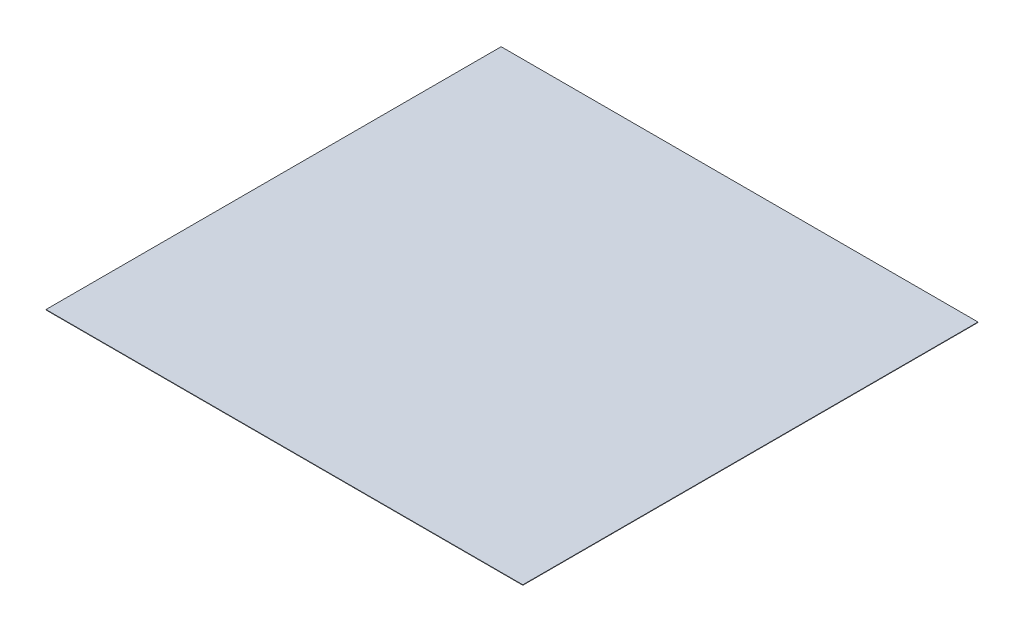
ISO-10303-21;
HEADER;
FILE_DESCRIPTION(('STEP AP214'),'2;1');
FILE_NAME('part.step','',(''),(''),'','','');
FILE_SCHEMA(('AUTOMOTIVE_DESIGN { 1 0 10303 214 1 1 1 1 }'));
ENDSEC;
DATA;
#1=APPLICATION_CONTEXT('core data for automotive mechanical design processes');
#2=APPLICATION_PROTOCOL_DEFINITION('international standard','automotive_design',2000,#1);
#3=PRODUCT_CONTEXT('',#1,'mechanical');
#4=PRODUCT('Part','Part','',(#3));
#5=PRODUCT_RELATED_PRODUCT_CATEGORY('part','',(#4));
#6=PRODUCT_DEFINITION_FORMATION('','',#4);
#7=PRODUCT_DEFINITION_CONTEXT('part definition',#1,'design');
#8=PRODUCT_DEFINITION('design','',#6,#7);
#9=PRODUCT_DEFINITION_SHAPE('','',#8);
#10=(LENGTH_UNIT() NAMED_UNIT(*) SI_UNIT(.MILLI.,.METRE.));
#11=(NAMED_UNIT(*) PLANE_ANGLE_UNIT() SI_UNIT($,.RADIAN.));
#12=(NAMED_UNIT(*) SI_UNIT($,.STERADIAN.) SOLID_ANGLE_UNIT());
#13=UNCERTAINTY_MEASURE_WITH_UNIT(LENGTH_MEASURE(1.E-05),#10,'distance_accuracy_value','');
#14=(GEOMETRIC_REPRESENTATION_CONTEXT(3) GLOBAL_UNCERTAINTY_ASSIGNED_CONTEXT((#13)) GLOBAL_UNIT_ASSIGNED_CONTEXT((#10,
#11,#12)) REPRESENTATION_CONTEXT('',''));
#15=CARTESIAN_POINT('',(0.,0.,0.));
#16=DIRECTION('',(0.,0.,1.));
#17=DIRECTION('',(1.,0.,0.));
#18=AXIS2_PLACEMENT_3D('',#15,#16,#17);
#19=CARTESIAN_POINT('',(-110.,0.2,105.));
#20=DIRECTION('',(1.,0.,0.));
#21=DIRECTION('',(0.,0.,-1.));
#22=AXIS2_PLACEMENT_3D('',#19,#20,#21);
#23=PLANE('',#22);
#24=DIRECTION('',(0.,0.,1.));
#25=VECTOR('',#24,1.);
#26=CARTESIAN_POINT('',(-110.,0.,105.));
#27=LINE('',#26,#25);
#28=CARTESIAN_POINT('',(-110.,0.,-105.));
#29=VERTEX_POINT('',#28);
#30=CARTESIAN_POINT('',(-110.,0.,105.));
#31=VERTEX_POINT('',#30);
#32=EDGE_CURVE('E96',#29,#31,#27,.T.);
#33=ORIENTED_EDGE('',*,*,#32,.T.);
#34=DIRECTION('',(0.,-1.,0.));
#35=VECTOR('',#34,1.);
#36=CARTESIAN_POINT('',(-110.,0.2,105.));
#37=LINE('',#36,#35);
#38=CARTESIAN_POINT('',(-110.,0.2,105.));
#39=VERTEX_POINT('',#38);
#40=EDGE_CURVE('E11',#39,#31,#37,.T.);
#41=ORIENTED_EDGE('',*,*,#40,.F.);
#42=DIRECTION('',(0.,0.,1.));
#43=VECTOR('',#42,1.);
#44=CARTESIAN_POINT('',(-110.,0.2,105.));
#45=LINE('',#44,#43);
#46=CARTESIAN_POINT('',(-110.,0.2,-105.));
#47=VERTEX_POINT('',#46);
#48=EDGE_CURVE('E84',#47,#39,#45,.T.);
#49=ORIENTED_EDGE('',*,*,#48,.F.);
#50=DIRECTION('',(0.,-1.,0.));
#51=VECTOR('',#50,1.);
#52=CARTESIAN_POINT('',(-110.,0.2,-105.));
#53=LINE('',#52,#51);
#54=EDGE_CURVE('E92',#47,#29,#53,.T.);
#55=ORIENTED_EDGE('',*,*,#54,.T.);
#56=EDGE_LOOP('',(#33,#41,#49,#55));
#57=FACE_BOUND('',#56,.T.);
#58=ADVANCED_FACE('F33',(#57),#23,.F.);
#59=CARTESIAN_POINT('',(110.,0.2,105.));
#60=DIRECTION('',(0.,0.,-1.));
#61=DIRECTION('',(-1.,0.,0.));
#62=AXIS2_PLACEMENT_3D('',#59,#60,#61);
#63=PLANE('',#62);
#64=DIRECTION('',(1.,0.,0.));
#65=VECTOR('',#64,1.);
#66=CARTESIAN_POINT('',(110.,0.,105.));
#67=LINE('',#66,#65);
#68=CARTESIAN_POINT('',(110.,0.,105.));
#69=VERTEX_POINT('',#68);
#70=EDGE_CURVE('E88',#31,#69,#67,.T.);
#71=ORIENTED_EDGE('',*,*,#70,.T.);
#72=DIRECTION('',(0.,-1.,0.));
#73=VECTOR('',#72,1.);
#74=CARTESIAN_POINT('',(110.,0.2,105.));
#75=LINE('',#74,#73);
#76=CARTESIAN_POINT('',(110.,0.2,105.));
#77=VERTEX_POINT('',#76);
#78=EDGE_CURVE('E41',#77,#69,#75,.T.);
#79=ORIENTED_EDGE('',*,*,#78,.F.);
#80=DIRECTION('',(1.,0.,0.));
#81=VECTOR('',#80,1.);
#82=CARTESIAN_POINT('',(110.,0.2,105.));
#83=LINE('',#82,#81);
#84=EDGE_CURVE('E79',#39,#77,#83,.T.);
#85=ORIENTED_EDGE('',*,*,#84,.F.);
#86=ORIENTED_EDGE('',*,*,#40,.T.);
#87=EDGE_LOOP('',(#71,#79,#85,#86));
#88=FACE_BOUND('',#87,.T.);
#89=ADVANCED_FACE('F87',(#88),#63,.F.);
#90=CARTESIAN_POINT('',(110.,0.2,105.));
#91=DIRECTION('',(-1.,0.,0.));
#92=DIRECTION('',(0.,0.,1.));
#93=AXIS2_PLACEMENT_3D('',#90,#91,#92);
#94=PLANE('',#93);
#95=DIRECTION('',(0.,0.,-1.));
#96=VECTOR('',#95,1.);
#97=CARTESIAN_POINT('',(110.,0.,105.));
#98=LINE('',#97,#96);
#99=CARTESIAN_POINT('',(110.,0.,-105.));
#100=VERTEX_POINT('',#99);
#101=EDGE_CURVE('E66',#69,#100,#98,.T.);
#102=ORIENTED_EDGE('',*,*,#101,.T.);
#103=DIRECTION('',(0.,-1.,0.));
#104=VECTOR('',#103,1.);
#105=CARTESIAN_POINT('',(110.,0.2,-105.));
#106=LINE('',#105,#104);
#107=CARTESIAN_POINT('',(110.,0.2,-105.));
#108=VERTEX_POINT('',#107);
#109=EDGE_CURVE('E89',#108,#100,#106,.T.);
#110=ORIENTED_EDGE('',*,*,#109,.F.);
#111=DIRECTION('',(0.,0.,-1.));
#112=VECTOR('',#111,1.);
#113=CARTESIAN_POINT('',(110.,0.2,105.));
#114=LINE('',#113,#112);
#115=EDGE_CURVE('E82',#77,#108,#114,.T.);
#116=ORIENTED_EDGE('',*,*,#115,.F.);
#117=ORIENTED_EDGE('',*,*,#78,.T.);
#118=EDGE_LOOP('',(#102,#110,#116,#117));
#119=FACE_BOUND('',#118,.T.);
#120=ADVANCED_FACE('F90',(#119),#94,.F.);
#121=CARTESIAN_POINT('',(110.,0.2,-105.));
#122=DIRECTION('',(0.,0.,1.));
#123=DIRECTION('',(1.,0.,0.));
#124=AXIS2_PLACEMENT_3D('',#121,#122,#123);
#125=PLANE('',#124);
#126=DIRECTION('',(-1.,0.,0.));
#127=VECTOR('',#126,1.);
#128=CARTESIAN_POINT('',(110.,0.,-105.));
#129=LINE('',#128,#127);
#130=EDGE_CURVE('E72',#100,#29,#129,.T.);
#131=ORIENTED_EDGE('',*,*,#130,.T.);
#132=ORIENTED_EDGE('',*,*,#54,.F.);
#133=DIRECTION('',(-1.,0.,0.));
#134=VECTOR('',#133,1.);
#135=CARTESIAN_POINT('',(110.,0.2,-105.));
#136=LINE('',#135,#134);
#137=EDGE_CURVE('E49',#108,#47,#136,.T.);
#138=ORIENTED_EDGE('',*,*,#137,.F.);
#139=ORIENTED_EDGE('',*,*,#109,.T.);
#140=EDGE_LOOP('',(#131,#132,#138,#139));
#141=FACE_BOUND('',#140,.T.);
#142=ADVANCED_FACE('F103',(#141),#125,.F.);
#143=CARTESIAN_POINT('',(0.,0.2,0.));
#144=DIRECTION('',(0.,1.,0.));
#145=DIRECTION('',(0.,0.,1.));
#146=AXIS2_PLACEMENT_3D('',#143,#144,#145);
#147=PLANE('',#146);
#148=ORIENTED_EDGE('',*,*,#48,.T.);
#149=ORIENTED_EDGE('',*,*,#84,.T.);
#150=ORIENTED_EDGE('',*,*,#115,.T.);
#151=ORIENTED_EDGE('',*,*,#137,.T.);
#152=EDGE_LOOP('',(#148,#149,#150,#151));
#153=FACE_BOUND('',#152,.T.);
#154=ADVANCED_FACE('F80',(#153),#147,.T.);
#155=CARTESIAN_POINT('',(0.,0.,0.));
#156=DIRECTION('',(0.,1.,0.));
#157=DIRECTION('',(0.,0.,1.));
#158=AXIS2_PLACEMENT_3D('',#155,#156,#157);
#159=PLANE('',#158);
#160=ORIENTED_EDGE('',*,*,#32,.F.);
#161=ORIENTED_EDGE('',*,*,#130,.F.);
#162=ORIENTED_EDGE('',*,*,#101,.F.);
#163=ORIENTED_EDGE('',*,*,#70,.F.);
#164=EDGE_LOOP('',(#160,#161,#162,#163));
#165=FACE_BOUND('',#164,.T.);
#166=ADVANCED_FACE('F106',(#165),#159,.F.);
#167=CLOSED_SHELL('',(#58,#89,#120,#142,#154,#166));
#168=MANIFOLD_SOLID_BREP('B2',#167);
#169=ADVANCED_BREP_SHAPE_REPRESENTATION('',(#18,#168),#14);
#170=SHAPE_DEFINITION_REPRESENTATION(#9,#169);
ENDSEC;
END-ISO-10303-21;
